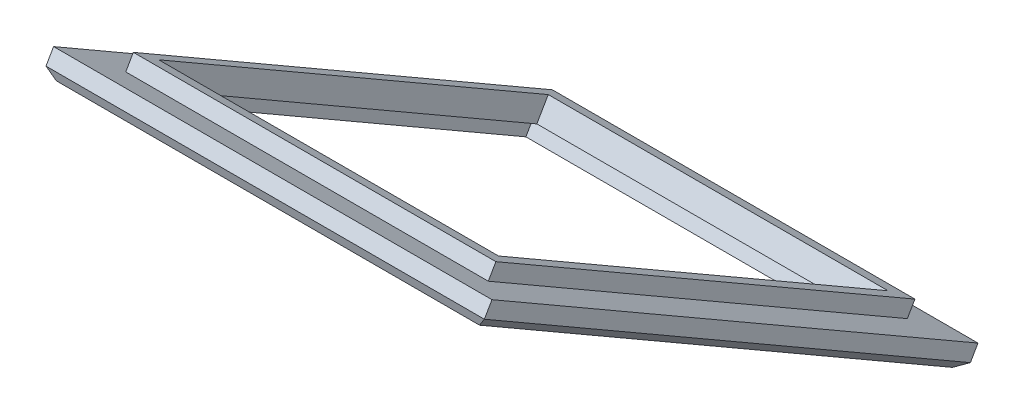
ISO-10303-21;
HEADER;
FILE_DESCRIPTION(('STEP AP214'),'2;1');
FILE_NAME('part.step','',(''),(''),'','','');
FILE_SCHEMA(('AUTOMOTIVE_DESIGN { 1 0 10303 214 1 1 1 1 }'));
ENDSEC;
DATA;
#1=APPLICATION_CONTEXT('core data for automotive mechanical design processes');
#2=APPLICATION_PROTOCOL_DEFINITION('international standard','automotive_design',2000,#1);
#3=PRODUCT_CONTEXT('',#1,'mechanical');
#4=PRODUCT('Part','Part','',(#3));
#5=PRODUCT_RELATED_PRODUCT_CATEGORY('part','',(#4));
#6=PRODUCT_DEFINITION_FORMATION('','',#4);
#7=PRODUCT_DEFINITION_CONTEXT('part definition',#1,'design');
#8=PRODUCT_DEFINITION('design','',#6,#7);
#9=PRODUCT_DEFINITION_SHAPE('','',#8);
#10=(LENGTH_UNIT() NAMED_UNIT(*) SI_UNIT(.MILLI.,.METRE.));
#11=(NAMED_UNIT(*) PLANE_ANGLE_UNIT() SI_UNIT($,.RADIAN.));
#12=(NAMED_UNIT(*) SI_UNIT($,.STERADIAN.) SOLID_ANGLE_UNIT());
#13=UNCERTAINTY_MEASURE_WITH_UNIT(LENGTH_MEASURE(1.E-05),#10,'distance_accuracy_value','');
#14=(GEOMETRIC_REPRESENTATION_CONTEXT(3) GLOBAL_UNCERTAINTY_ASSIGNED_CONTEXT((#13)) GLOBAL_UNIT_ASSIGNED_CONTEXT((#10,
#11,#12)) REPRESENTATION_CONTEXT('',''));
#15=CARTESIAN_POINT('',(0.,0.,0.));
#16=DIRECTION('',(0.,0.,1.));
#17=DIRECTION('',(1.,0.,0.));
#18=AXIS2_PLACEMENT_3D('',#15,#16,#17);
#19=CARTESIAN_POINT('',(-20.3754297395793,-24.2225456393446,122.650648453835));
#20=DIRECTION('',(-1.,0.,0.));
#21=DIRECTION('',(0.,0.,1.));
#22=AXIS2_PLACEMENT_3D('',#19,#20,#21);
#23=PLANE('',#22);
#24=DIRECTION('',(0.,0.500000000000004,0.866025403784437));
#25=VECTOR('',#24,1.);
#26=CARTESIAN_POINT('',(-20.3754297395793,-25.0885710431292,123.150648453835));
#27=LINE('',#26,#25);
#28=CARTESIAN_POINT('',(-20.3754297395793,-54.7385710431249,71.7953420094262));
#29=VERTEX_POINT('',#28);
#30=CARTESIAN_POINT('',(-20.3754297395793,-25.0885710431292,123.150648453835));
#31=VERTEX_POINT('',#30);
#32=EDGE_CURVE('E210',#29,#31,#27,.T.);
#33=ORIENTED_EDGE('',*,*,#32,.F.);
#34=DIRECTION('',(0.,-0.866025403784436,0.500000000000004));
#35=VECTOR('',#34,1.);
#36=CARTESIAN_POINT('',(-20.3754297395793,-53.8725456393404,71.2953420094261));
#37=LINE('',#36,#35);
#38=CARTESIAN_POINT('',(-20.3754297395793,-52.1404948317715,70.2953420094261));
#39=VERTEX_POINT('',#38);
#40=EDGE_CURVE('E268',#39,#29,#37,.T.);
#41=ORIENTED_EDGE('',*,*,#40,.F.);
#42=DIRECTION('',(0.,-0.500000000000004,-0.866025403784436));
#43=VECTOR('',#42,1.);
#44=CARTESIAN_POINT('',(-20.3754297395793,-22.4904948317758,121.650648453835));
#45=LINE('',#44,#43);
#46=CARTESIAN_POINT('',(-20.3754297395793,-22.4904948317758,121.650648453835));
#47=VERTEX_POINT('',#46);
#48=EDGE_CURVE('E229',#47,#39,#45,.T.);
#49=ORIENTED_EDGE('',*,*,#48,.F.);
#50=DIRECTION('',(0.,-0.866025403784436,0.500000000000004));
#51=VECTOR('',#50,1.);
#52=CARTESIAN_POINT('',(-20.3754297395793,-24.2225456393446,122.650648453835));
#53=LINE('',#52,#51);
#54=EDGE_CURVE('E256',#47,#31,#53,.T.);
#55=ORIENTED_EDGE('',*,*,#54,.T.);
#56=EDGE_LOOP('',(#33,#41,#49,#55));
#57=FACE_BOUND('',#56,.T.);
#58=ADVANCED_FACE('F41',(#57),#23,.F.);
#59=CARTESIAN_POINT('',(24.4245702604207,-24.2225456393447,122.650648453835));
#60=DIRECTION('',(0.,0.500000000000004,0.866025403784436));
#61=DIRECTION('',(0.,-0.866025403784436,0.500000000000004));
#62=AXIS2_PLACEMENT_3D('',#59,#60,#61);
#63=PLANE('',#62);
#64=DIRECTION('',(1.,0.,0.));
#65=VECTOR('',#64,1.);
#66=CARTESIAN_POINT('',(24.4245702604207,-25.0885710431292,123.150648453835));
#67=LINE('',#66,#65);
#68=CARTESIAN_POINT('',(24.4245702604207,-25.0885710431292,123.150648453835));
#69=VERTEX_POINT('',#68);
#70=EDGE_CURVE('E201',#31,#69,#67,.T.);
#71=ORIENTED_EDGE('',*,*,#70,.F.);
#72=ORIENTED_EDGE('',*,*,#54,.F.);
#73=DIRECTION('',(-1.,0.,0.));
#74=VECTOR('',#73,1.);
#75=CARTESIAN_POINT('',(24.4245702604207,-22.4904948317758,121.650648453835));
#76=LINE('',#75,#74);
#77=CARTESIAN_POINT('',(24.4245702604207,-22.4904948317758,121.650648453835));
#78=VERTEX_POINT('',#77);
#79=EDGE_CURVE('E211',#78,#47,#76,.T.);
#80=ORIENTED_EDGE('',*,*,#79,.F.);
#81=DIRECTION('',(0.,-0.866025403784436,0.500000000000004));
#82=VECTOR('',#81,1.);
#83=CARTESIAN_POINT('',(24.4245702604207,-24.2225456393447,122.650648453835));
#84=LINE('',#83,#82);
#85=EDGE_CURVE('E265',#78,#69,#84,.T.);
#86=ORIENTED_EDGE('',*,*,#85,.T.);
#87=EDGE_LOOP('',(#71,#72,#80,#86));
#88=FACE_BOUND('',#87,.T.);
#89=ADVANCED_FACE('F370',(#88),#63,.F.);
#90=CARTESIAN_POINT('',(24.4245702604207,-53.8725456393404,71.2953420094261));
#91=DIRECTION('',(1.,0.,0.));
#92=DIRECTION('',(0.,0.,-1.));
#93=AXIS2_PLACEMENT_3D('',#90,#91,#92);
#94=PLANE('',#93);
#95=DIRECTION('',(0.,-0.500000000000004,-0.866025403784437));
#96=VECTOR('',#95,1.);
#97=CARTESIAN_POINT('',(24.4245702604207,-54.7385710431249,71.7953420094261));
#98=LINE('',#97,#96);
#99=CARTESIAN_POINT('',(24.4245702604207,-54.7385710431249,71.7953420094261));
#100=VERTEX_POINT('',#99);
#101=EDGE_CURVE('E62',#69,#100,#98,.T.);
#102=ORIENTED_EDGE('',*,*,#101,.F.);
#103=ORIENTED_EDGE('',*,*,#85,.F.);
#104=DIRECTION('',(0.,0.500000000000004,0.866025403784436));
#105=VECTOR('',#104,1.);
#106=CARTESIAN_POINT('',(24.4245702604207,-52.1404948317715,70.2953420094261));
#107=LINE('',#106,#105);
#108=CARTESIAN_POINT('',(24.4245702604207,-52.1404948317715,70.2953420094261));
#109=VERTEX_POINT('',#108);
#110=EDGE_CURVE('E255',#109,#78,#107,.T.);
#111=ORIENTED_EDGE('',*,*,#110,.F.);
#112=DIRECTION('',(0.,-0.866025403784436,0.500000000000004));
#113=VECTOR('',#112,1.);
#114=CARTESIAN_POINT('',(24.4245702604207,-53.8725456393404,71.2953420094261));
#115=LINE('',#114,#113);
#116=EDGE_CURVE('E264',#109,#100,#115,.T.);
#117=ORIENTED_EDGE('',*,*,#116,.T.);
#118=EDGE_LOOP('',(#102,#103,#111,#117));
#119=FACE_BOUND('',#118,.T.);
#120=ADVANCED_FACE('F372',(#119),#94,.F.);
#121=CARTESIAN_POINT('',(-20.3754297395793,-53.8725456393404,71.2953420094261));
#122=DIRECTION('',(0.,-0.500000000000004,-0.866025403784436));
#123=DIRECTION('',(0.,0.866025403784436,-0.500000000000004));
#124=AXIS2_PLACEMENT_3D('',#121,#122,#123);
#125=PLANE('',#124);
#126=DIRECTION('',(-1.,0.,0.));
#127=VECTOR('',#126,1.);
#128=CARTESIAN_POINT('',(-20.3754297395793,-54.7385710431249,71.7953420094262));
#129=LINE('',#128,#127);
#130=EDGE_CURVE('E11',#100,#29,#129,.T.);
#131=ORIENTED_EDGE('',*,*,#130,.F.);
#132=ORIENTED_EDGE('',*,*,#116,.F.);
#133=DIRECTION('',(1.,0.,0.));
#134=VECTOR('',#133,1.);
#135=CARTESIAN_POINT('',(-20.3754297395793,-52.1404948317715,70.2953420094261));
#136=LINE('',#135,#134);
#137=EDGE_CURVE('E231',#39,#109,#136,.T.);
#138=ORIENTED_EDGE('',*,*,#137,.F.);
#139=ORIENTED_EDGE('',*,*,#40,.T.);
#140=EDGE_LOOP('',(#131,#132,#138,#139));
#141=FACE_BOUND('',#140,.T.);
#142=ADVANCED_FACE('F378',(#141),#125,.F.);
#143=CARTESIAN_POINT('',(0.,-71.2761979053367,41.1513320474596));
#144=DIRECTION('',(0.,-0.866025403784436,0.500000000000004));
#145=DIRECTION('',(0.,-0.500000000000004,-0.866025403784436));
#146=AXIS2_PLACEMENT_3D('',#143,#144,#145);
#147=PLANE('',#146);
#148=DIRECTION('',(0.,-0.500000000000004,-0.866025403784436));
#149=VECTOR('',#148,1.);
#150=CARTESIAN_POINT('',(-26.8754297395794,-20.5475456393428,129.015935171654));
#151=LINE('',#150,#149);
#152=CARTESIAN_POINT('',(-26.8754297395794,-20.5475456393428,129.015935171654));
#153=VERTEX_POINT('',#152);
#154=CARTESIAN_POINT('',(-26.8754297395794,-57.5475456393431,64.9300552916059));
#155=VERTEX_POINT('',#154);
#156=EDGE_CURVE('E261',#153,#155,#151,.T.);
#157=ORIENTED_EDGE('',*,*,#156,.F.);
#158=DIRECTION('',(-1.,0.,0.));
#159=VECTOR('',#158,1.);
#160=CARTESIAN_POINT('',(30.9245702604208,-20.5475456393428,129.015935171654));
#161=LINE('',#160,#159);
#162=CARTESIAN_POINT('',(30.9245702604208,-20.5475456393428,129.015935171654));
#163=VERTEX_POINT('',#162);
#164=EDGE_CURVE('E279',#163,#153,#161,.T.);
#165=ORIENTED_EDGE('',*,*,#164,.F.);
#166=DIRECTION('',(0.,0.500000000000004,0.866025403784436));
#167=VECTOR('',#166,1.);
#168=CARTESIAN_POINT('',(30.9245702604208,-57.5475456393431,64.9300552916059));
#169=LINE('',#168,#167);
#170=CARTESIAN_POINT('',(30.9245702604208,-57.5475456393431,64.9300552916059));
#171=VERTEX_POINT('',#170);
#172=EDGE_CURVE('E280',#171,#163,#169,.T.);
#173=ORIENTED_EDGE('',*,*,#172,.F.);
#174=DIRECTION('',(1.,0.,0.));
#175=VECTOR('',#174,1.);
#176=CARTESIAN_POINT('',(-26.8754297395794,-57.5475456393431,64.9300552916059));
#177=LINE('',#176,#175);
#178=EDGE_CURVE('E274',#155,#171,#177,.T.);
#179=ORIENTED_EDGE('',*,*,#178,.F.);
#180=EDGE_LOOP('',(#157,#165,#173,#179));
#181=FACE_BOUND('',#180,.T.);
#182=DIRECTION('',(0.,-0.500000000000004,-0.866025403784436));
#183=VECTOR('',#182,1.);
#184=CARTESIAN_POINT('',(26.0245702604206,-23.0975456393428,124.599205612354));
#185=LINE('',#184,#183);
#186=CARTESIAN_POINT('',(26.0245702604206,-23.0975456393428,124.599205612354));
#187=VERTEX_POINT('',#186);
#188=CARTESIAN_POINT('',(26.0245702604206,-54.9975456393431,69.3467848509065));
#189=VERTEX_POINT('',#188);
#190=EDGE_CURVE('E221',#187,#189,#185,.T.);
#191=ORIENTED_EDGE('',*,*,#190,.F.);
#192=DIRECTION('',(1.,0.,0.));
#193=VECTOR('',#192,1.);
#194=CARTESIAN_POINT('',(26.0245702604206,-23.0975456393428,124.599205612354));
#195=LINE('',#194,#193);
#196=CARTESIAN_POINT('',(-21.7754297395794,-23.0975456393428,124.599205612354));
#197=VERTEX_POINT('',#196);
#198=EDGE_CURVE('E208',#197,#187,#195,.T.);
#199=ORIENTED_EDGE('',*,*,#198,.F.);
#200=DIRECTION('',(0.,0.500000000000004,0.866025403784436));
#201=VECTOR('',#200,1.);
#202=CARTESIAN_POINT('',(-21.7754297395794,-23.0975456393428,124.599205612354));
#203=LINE('',#202,#201);
#204=CARTESIAN_POINT('',(-21.7754297395794,-54.9975456393431,69.3467848509064));
#205=VERTEX_POINT('',#204);
#206=EDGE_CURVE('E214',#205,#197,#203,.T.);
#207=ORIENTED_EDGE('',*,*,#206,.F.);
#208=DIRECTION('',(-1.,0.,0.));
#209=VECTOR('',#208,1.);
#210=CARTESIAN_POINT('',(26.0245702604206,-54.9975456393431,69.3467848509066));
#211=LINE('',#210,#209);
#212=EDGE_CURVE('E219',#189,#205,#211,.T.);
#213=ORIENTED_EDGE('',*,*,#212,.F.);
#214=EDGE_LOOP('',(#191,#199,#207,#213));
#215=FACE_BOUND('',#214,.T.);
#216=ADVANCED_FACE('F336',(#181,#215),#147,.F.);
#217=CARTESIAN_POINT('',(-26.8754297395794,-20.5475456393428,129.015935171654));
#218=DIRECTION('',(-1.,0.,0.));
#219=DIRECTION('',(0.,0.,1.));
#220=AXIS2_PLACEMENT_3D('',#217,#218,#219);
#221=PLANE('',#220);
#222=DIRECTION('',(0.,-0.866025403784436,0.500000000000004));
#223=VECTOR('',#222,1.);
#224=CARTESIAN_POINT('',(-26.8754297395794,-57.5475456393431,64.9300552916059));
#225=LINE('',#224,#223);
#226=CARTESIAN_POINT('',(-26.8754297395794,-59.279596446912,65.9300552916059));
#227=VERTEX_POINT('',#226);
#228=EDGE_CURVE('E283',#155,#227,#225,.T.);
#229=ORIENTED_EDGE('',*,*,#228,.T.);
#230=DIRECTION('',(0.,0.500000000000004,0.866025403784436));
#231=VECTOR('',#230,1.);
#232=CARTESIAN_POINT('',(-26.8754297395794,-22.2795964469117,130.015935171654));
#233=LINE('',#232,#231);
#234=CARTESIAN_POINT('',(-26.8754297395794,-22.2795964469116,130.015935171654));
#235=VERTEX_POINT('',#234);
#236=EDGE_CURVE('E307',#227,#235,#233,.T.);
#237=ORIENTED_EDGE('',*,*,#236,.T.);
#238=DIRECTION('',(0.,-0.866025403784436,0.500000000000004));
#239=VECTOR('',#238,1.);
#240=CARTESIAN_POINT('',(-26.8754297395794,-20.5475456393428,129.015935171654));
#241=LINE('',#240,#239);
#242=EDGE_CURVE('E282',#153,#235,#241,.T.);
#243=ORIENTED_EDGE('',*,*,#242,.F.);
#244=ORIENTED_EDGE('',*,*,#156,.T.);
#245=EDGE_LOOP('',(#229,#237,#243,#244));
#246=FACE_BOUND('',#245,.T.);
#247=ADVANCED_FACE('F343',(#246),#221,.T.);
#248=CARTESIAN_POINT('',(30.9245702604208,-20.5475456393428,129.015935171654));
#249=DIRECTION('',(0.,0.500000000000004,0.866025403784436));
#250=DIRECTION('',(0.,-0.866025403784436,0.500000000000004));
#251=AXIS2_PLACEMENT_3D('',#248,#249,#250);
#252=PLANE('',#251);
#253=ORIENTED_EDGE('',*,*,#242,.T.);
#254=DIRECTION('',(1.,0.,0.));
#255=VECTOR('',#254,1.);
#256=CARTESIAN_POINT('',(30.9245702604208,-22.2795964469117,130.015935171654));
#257=LINE('',#256,#255);
#258=CARTESIAN_POINT('',(30.9245702604208,-22.2795964469117,130.015935171654));
#259=VERTEX_POINT('',#258);
#260=EDGE_CURVE('E49',#235,#259,#257,.T.);
#261=ORIENTED_EDGE('',*,*,#260,.T.);
#262=DIRECTION('',(0.,-0.866025403784436,0.500000000000004));
#263=VECTOR('',#262,1.);
#264=CARTESIAN_POINT('',(30.9245702604208,-20.5475456393428,129.015935171654));
#265=LINE('',#264,#263);
#266=EDGE_CURVE('E288',#163,#259,#265,.T.);
#267=ORIENTED_EDGE('',*,*,#266,.F.);
#268=ORIENTED_EDGE('',*,*,#164,.T.);
#269=EDGE_LOOP('',(#253,#261,#267,#268));
#270=FACE_BOUND('',#269,.T.);
#271=ADVANCED_FACE('F329',(#270),#252,.T.);
#272=CARTESIAN_POINT('',(30.9245702604208,-57.5475456393431,64.9300552916059));
#273=DIRECTION('',(1.,0.,0.));
#274=DIRECTION('',(0.,0.,-1.));
#275=AXIS2_PLACEMENT_3D('',#272,#273,#274);
#276=PLANE('',#275);
#277=ORIENTED_EDGE('',*,*,#266,.T.);
#278=DIRECTION('',(0.,-0.500000000000004,-0.866025403784436));
#279=VECTOR('',#278,1.);
#280=CARTESIAN_POINT('',(30.9245702604208,-59.279596446912,65.9300552916059));
#281=LINE('',#280,#279);
#282=CARTESIAN_POINT('',(30.9245702604208,-59.279596446912,65.9300552916059));
#283=VERTEX_POINT('',#282);
#284=EDGE_CURVE('E310',#259,#283,#281,.T.);
#285=ORIENTED_EDGE('',*,*,#284,.T.);
#286=DIRECTION('',(0.,-0.866025403784436,0.500000000000004));
#287=VECTOR('',#286,1.);
#288=CARTESIAN_POINT('',(30.9245702604208,-57.5475456393431,64.9300552916059));
#289=LINE('',#288,#287);
#290=EDGE_CURVE('E293',#171,#283,#289,.T.);
#291=ORIENTED_EDGE('',*,*,#290,.F.);
#292=ORIENTED_EDGE('',*,*,#172,.T.);
#293=EDGE_LOOP('',(#277,#285,#291,#292));
#294=FACE_BOUND('',#293,.T.);
#295=ADVANCED_FACE('F335',(#294),#276,.T.);
#296=CARTESIAN_POINT('',(-26.8754297395794,-57.5475456393431,64.9300552916059));
#297=DIRECTION('',(0.,-0.500000000000004,-0.866025403784436));
#298=DIRECTION('',(0.,0.866025403784436,-0.500000000000004));
#299=AXIS2_PLACEMENT_3D('',#296,#297,#298);
#300=PLANE('',#299);
#301=ORIENTED_EDGE('',*,*,#290,.T.);
#302=DIRECTION('',(-1.,0.,0.));
#303=VECTOR('',#302,1.);
#304=CARTESIAN_POINT('',(-26.8754297395794,-59.279596446912,65.9300552916059));
#305=LINE('',#304,#303);
#306=EDGE_CURVE('E302',#283,#227,#305,.T.);
#307=ORIENTED_EDGE('',*,*,#306,.T.);
#308=ORIENTED_EDGE('',*,*,#228,.F.);
#309=ORIENTED_EDGE('',*,*,#178,.T.);
#310=EDGE_LOOP('',(#301,#307,#308,#309));
#311=FACE_BOUND('',#310,.T.);
#312=ADVANCED_FACE('F341',(#311),#300,.T.);
#313=CARTESIAN_POINT('',(0.,-73.87427411669,42.6513320474596));
#314=DIRECTION('',(0.,-0.866025403784436,0.500000000000004));
#315=DIRECTION('',(0.,-0.500000000000004,-0.866025403784436));
#316=AXIS2_PLACEMENT_3D('',#313,#314,#315);
#317=PLANE('',#316);
#318=DIRECTION('',(0.,-0.500000000000004,-0.866025403784437));
#319=VECTOR('',#318,1.);
#320=CARTESIAN_POINT('',(-22.0754297395793,-26.0956218506958,125.406385289327));
#321=LINE('',#320,#319);
#322=CARTESIAN_POINT('',(-22.0754297395793,-26.0956218506958,125.406385289327));
#323=VERTEX_POINT('',#322);
#324=CARTESIAN_POINT('',(-22.0754297395793,-57.195621850696,71.5396051739348));
#325=VERTEX_POINT('',#324);
#326=EDGE_CURVE('E60',#323,#325,#321,.T.);
#327=ORIENTED_EDGE('',*,*,#326,.F.);
#328=DIRECTION('',(-1.,0.,0.));
#329=VECTOR('',#328,1.);
#330=CARTESIAN_POINT('',(-22.0754297395793,-26.0956218506958,125.406385289327));
#331=LINE('',#330,#329);
#332=CARTESIAN_POINT('',(26.1245702604207,-26.0956218506958,125.406385289327));
#333=VERTEX_POINT('',#332);
#334=EDGE_CURVE('E187',#333,#323,#331,.T.);
#335=ORIENTED_EDGE('',*,*,#334,.F.);
#336=DIRECTION('',(0.,0.500000000000004,0.866025403784436));
#337=VECTOR('',#336,1.);
#338=CARTESIAN_POINT('',(26.1245702604207,-26.0956218506958,125.406385289327));
#339=LINE('',#338,#337);
#340=CARTESIAN_POINT('',(26.1245702604207,-57.195621850696,71.5396051739348));
#341=VERTEX_POINT('',#340);
#342=EDGE_CURVE('E186',#341,#333,#339,.T.);
#343=ORIENTED_EDGE('',*,*,#342,.F.);
#344=DIRECTION('',(1.,0.,0.));
#345=VECTOR('',#344,1.);
#346=CARTESIAN_POINT('',(-22.0754297395793,-57.195621850696,71.5396051739348));
#347=LINE('',#346,#345);
#348=EDGE_CURVE('E194',#325,#341,#347,.T.);
#349=ORIENTED_EDGE('',*,*,#348,.F.);
#350=EDGE_LOOP('',(#327,#335,#343,#349));
#351=FACE_BOUND('',#350,.T.);
#352=DIRECTION('',(0.,-0.500000000000004,-0.866025403784436));
#353=VECTOR('',#352,1.);
#354=CARTESIAN_POINT('',(-25.8754297395794,-73.87427411669,42.6513320474596));
#355=LINE('',#354,#353);
#356=CARTESIAN_POINT('',(-25.8754297395794,-23.6456218506961,129.64990976787));
#357=VERTEX_POINT('',#356);
#358=CARTESIAN_POINT('',(-25.8754297395794,-59.6456218506964,67.2960806953904));
#359=VERTEX_POINT('',#358);
#360=EDGE_CURVE('E300',#357,#359,#355,.T.);
#361=ORIENTED_EDGE('',*,*,#360,.T.);
#362=DIRECTION('',(1.,0.,0.));
#363=VECTOR('',#362,1.);
#364=CARTESIAN_POINT('',(0.,-59.6456218506964,67.2960806953904));
#365=LINE('',#364,#363);
#366=CARTESIAN_POINT('',(29.9245702604208,-59.6456218506964,67.2960806953904));
#367=VERTEX_POINT('',#366);
#368=EDGE_CURVE('E301',#359,#367,#365,.T.);
#369=ORIENTED_EDGE('',*,*,#368,.T.);
#370=DIRECTION('',(0.,0.500000000000004,0.866025403784436));
#371=VECTOR('',#370,1.);
#372=CARTESIAN_POINT('',(29.9245702604208,-73.87427411669,42.6513320474596));
#373=LINE('',#372,#371);
#374=CARTESIAN_POINT('',(29.9245702604208,-23.6456218506961,129.64990976787));
#375=VERTEX_POINT('',#374);
#376=EDGE_CURVE('E299',#367,#375,#373,.T.);
#377=ORIENTED_EDGE('',*,*,#376,.T.);
#378=DIRECTION('',(-1.,0.,0.));
#379=VECTOR('',#378,1.);
#380=CARTESIAN_POINT('',(0.,-23.6456218506961,129.64990976787));
#381=LINE('',#380,#379);
#382=EDGE_CURVE('E290',#375,#357,#381,.T.);
#383=ORIENTED_EDGE('',*,*,#382,.T.);
#384=EDGE_LOOP('',(#361,#369,#377,#383));
#385=FACE_BOUND('',#384,.T.);
#386=ADVANCED_FACE('F353',(#351,#385),#317,.T.);
#387=CARTESIAN_POINT('',(0.,-23.6456218506961,129.64990976787));
#388=DIRECTION('',(0.,0.258819045102513,-0.965925826289071));
#389=DIRECTION('',(-1.,0.,0.));
#390=AXIS2_PLACEMENT_3D('',#387,#388,#389);
#391=PLANE('',#390);
#392=DIRECTION('',(0.577350269189632,0.78867513459481,0.211324865405179));
#393=VECTOR('',#392,1.);
#394=CARTESIAN_POINT('',(19.949713506947,-37.2715295750519,125.998858796988));
#395=LINE('',#394,#393);
#396=EDGE_CURVE('E314',#259,#375,#395,.F.);
#397=ORIENTED_EDGE('',*,*,#396,.F.);
#398=ORIENTED_EDGE('',*,*,#260,.F.);
#399=DIRECTION('',(0.577350269189631,-0.788675134594811,-0.21132486540518));
#400=VECTOR('',#399,1.);
#401=CARTESIAN_POINT('',(-17.2502864930528,-35.4277866367311,126.492888228361));
#402=LINE('',#401,#400);
#403=EDGE_CURVE('E272',#357,#235,#402,.F.);
#404=ORIENTED_EDGE('',*,*,#403,.F.);
#405=ORIENTED_EDGE('',*,*,#382,.F.);
#406=EDGE_LOOP('',(#397,#398,#404,#405));
#407=FACE_BOUND('',#406,.T.);
#408=ADVANCED_FACE('F42',(#407),#391,.F.);
#409=CARTESIAN_POINT('',(-25.8754297395794,-73.87427411669,42.6513320474596));
#410=DIRECTION('',(0.707106781186544,0.612372435695796,-0.353553390593279));
#411=DIRECTION('',(0.,-0.500000000000004,-0.866025403784436));
#412=AXIS2_PLACEMENT_3D('',#409,#410,#411);
#413=PLANE('',#412);
#414=ORIENTED_EDGE('',*,*,#403,.T.);
#415=ORIENTED_EDGE('',*,*,#236,.F.);
#416=DIRECTION('',(0.577350269189626,-0.211324865405176,0.788675134594816));
#417=VECTOR('',#416,1.);
#418=CARTESIAN_POINT('',(-35.3611979169085,-56.1735897233841,54.3382803907488));
#419=LINE('',#418,#417);
#420=EDGE_CURVE('E312',#359,#227,#419,.F.);
#421=ORIENTED_EDGE('',*,*,#420,.F.);
#422=ORIENTED_EDGE('',*,*,#360,.F.);
#423=EDGE_LOOP('',(#414,#415,#421,#422));
#424=FACE_BOUND('',#423,.T.);
#425=ADVANCED_FACE('F325',(#424),#413,.F.);
#426=CARTESIAN_POINT('',(29.9245702604208,-73.87427411669,42.6513320474596));
#427=DIRECTION('',(-0.707106781186543,0.612372435695797,-0.353553390593279));
#428=DIRECTION('',(0.,0.500000000000004,0.866025403784436));
#429=AXIS2_PLACEMENT_3D('',#426,#427,#428);
#430=PLANE('',#429);
#431=ORIENTED_EDGE('',*,*,#396,.T.);
#432=ORIENTED_EDGE('',*,*,#376,.F.);
#433=DIRECTION('',(0.577350269189627,0.211324865405175,-0.788675134594815));
#434=VECTOR('',#433,1.);
#435=CARTESIAN_POINT('',(39.4103384377499,-56.1735897233841,54.3382803907488));
#436=LINE('',#435,#434);
#437=EDGE_CURVE('E253',#283,#367,#436,.F.);
#438=ORIENTED_EDGE('',*,*,#437,.F.);
#439=ORIENTED_EDGE('',*,*,#284,.F.);
#440=EDGE_LOOP('',(#431,#432,#438,#439));
#441=FACE_BOUND('',#440,.T.);
#442=ADVANCED_FACE('F352',(#441),#430,.F.);
#443=CARTESIAN_POINT('',(0.,-59.6456218506964,67.2960806953904));
#444=DIRECTION('',(0.,0.965925826289072,0.258819045102507));
#445=DIRECTION('',(1.,0.,0.));
#446=AXIS2_PLACEMENT_3D('',#443,#444,#445);
#447=PLANE('',#446);
#448=ORIENTED_EDGE('',*,*,#420,.T.);
#449=ORIENTED_EDGE('',*,*,#306,.F.);
#450=ORIENTED_EDGE('',*,*,#437,.T.);
#451=ORIENTED_EDGE('',*,*,#368,.F.);
#452=EDGE_LOOP('',(#448,#449,#450,#451));
#453=FACE_BOUND('',#452,.T.);
#454=ADVANCED_FACE('F350',(#453),#447,.F.);
#455=CARTESIAN_POINT('',(26.0245702604206,47.6740590485923,83.7392005947922));
#456=DIRECTION('',(-1.,0.,0.));
#457=DIRECTION('',(0.,0.,1.));
#458=AXIS2_PLACEMENT_3D('',#455,#456,#457);
#459=PLANE('',#458);
#460=DIRECTION('',(0.,-0.866025403784436,0.500000000000004));
#461=VECTOR('',#460,1.);
#462=CARTESIAN_POINT('',(26.0245702604206,15.774059048592,28.4867798333451));
#463=LINE('',#462,#461);
#464=CARTESIAN_POINT('',(26.0245702604206,-53.2654948317742,68.3467848509065));
#465=VERTEX_POINT('',#464);
#466=EDGE_CURVE('E224',#465,#189,#463,.T.);
#467=ORIENTED_EDGE('',*,*,#466,.F.);
#468=DIRECTION('',(0.,0.500000000000004,0.866025403784436));
#469=VECTOR('',#468,1.);
#470=CARTESIAN_POINT('',(26.0245702604206,-21.3654948317739,123.599205612354));
#471=LINE('',#470,#469);
#472=CARTESIAN_POINT('',(26.0245702604206,-21.3654948317739,123.599205612354));
#473=VERTEX_POINT('',#472);
#474=EDGE_CURVE('E209',#465,#473,#471,.T.);
#475=ORIENTED_EDGE('',*,*,#474,.T.);
#476=DIRECTION('',(0.,-0.866025403784436,0.500000000000004));
#477=VECTOR('',#476,1.);
#478=CARTESIAN_POINT('',(26.0245702604206,47.6740590485923,83.7392005947922));
#479=LINE('',#478,#477);
#480=EDGE_CURVE('E230',#473,#187,#479,.T.);
#481=ORIENTED_EDGE('',*,*,#480,.T.);
#482=ORIENTED_EDGE('',*,*,#190,.T.);
#483=EDGE_LOOP('',(#467,#475,#481,#482));
#484=FACE_BOUND('',#483,.T.);
#485=ADVANCED_FACE('F429',(#484),#459,.F.);
#486=CARTESIAN_POINT('',(26.0245702604206,15.774059048592,28.4867798333451));
#487=DIRECTION('',(0.,0.500000000000004,0.866025403784436));
#488=DIRECTION('',(0.,-0.866025403784437,0.500000000000004));
#489=AXIS2_PLACEMENT_3D('',#486,#487,#488);
#490=PLANE('',#489);
#491=DIRECTION('',(0.,-0.866025403784436,0.500000000000004));
#492=VECTOR('',#491,1.);
#493=CARTESIAN_POINT('',(-21.7754297395794,15.774059048592,28.4867798333451));
#494=LINE('',#493,#492);
#495=CARTESIAN_POINT('',(-21.7754297395794,-53.2654948317742,68.3467848509065));
#496=VERTEX_POINT('',#495);
#497=EDGE_CURVE('E217',#496,#205,#494,.T.);
#498=ORIENTED_EDGE('',*,*,#497,.F.);
#499=DIRECTION('',(1.,0.,0.));
#500=VECTOR('',#499,1.);
#501=CARTESIAN_POINT('',(26.0245702604206,-53.2654948317742,68.3467848509065));
#502=LINE('',#501,#500);
#503=EDGE_CURVE('E226',#496,#465,#502,.T.);
#504=ORIENTED_EDGE('',*,*,#503,.T.);
#505=ORIENTED_EDGE('',*,*,#466,.T.);
#506=ORIENTED_EDGE('',*,*,#212,.T.);
#507=EDGE_LOOP('',(#498,#504,#505,#506));
#508=FACE_BOUND('',#507,.T.);
#509=ADVANCED_FACE('F424',(#508),#490,.F.);
#510=CARTESIAN_POINT('',(-21.7754297395794,47.6740590485923,83.7392005947922));
#511=DIRECTION('',(1.,0.,0.));
#512=DIRECTION('',(0.,1.,0.));
#513=AXIS2_PLACEMENT_3D('',#510,#511,#512);
#514=PLANE('',#513);
#515=DIRECTION('',(0.,-0.866025403784436,0.500000000000004));
#516=VECTOR('',#515,1.);
#517=CARTESIAN_POINT('',(-21.7754297395794,47.6740590485923,83.7392005947922));
#518=LINE('',#517,#516);
#519=CARTESIAN_POINT('',(-21.7754297395794,-21.3654948317739,123.599205612354));
#520=VERTEX_POINT('',#519);
#521=EDGE_CURVE('E212',#520,#197,#518,.T.);
#522=ORIENTED_EDGE('',*,*,#521,.F.);
#523=DIRECTION('',(0.,-0.500000000000004,-0.866025403784436));
#524=VECTOR('',#523,1.);
#525=CARTESIAN_POINT('',(-21.7754297395794,-21.3654948317739,123.599205612354));
#526=LINE('',#525,#524);
#527=EDGE_CURVE('E223',#520,#496,#526,.T.);
#528=ORIENTED_EDGE('',*,*,#527,.T.);
#529=ORIENTED_EDGE('',*,*,#497,.T.);
#530=ORIENTED_EDGE('',*,*,#206,.T.);
#531=EDGE_LOOP('',(#522,#528,#529,#530));
#532=FACE_BOUND('',#531,.T.);
#533=ADVANCED_FACE('F423',(#532),#514,.F.);
#534=CARTESIAN_POINT('',(26.0245702604206,47.6740590485923,83.7392005947922));
#535=DIRECTION('',(0.,-0.500000000000004,-0.866025403784436));
#536=DIRECTION('',(0.,0.866025403784437,-0.500000000000004));
#537=AXIS2_PLACEMENT_3D('',#534,#535,#536);
#538=PLANE('',#537);
#539=ORIENTED_EDGE('',*,*,#480,.F.);
#540=DIRECTION('',(-1.,0.,0.));
#541=VECTOR('',#540,1.);
#542=CARTESIAN_POINT('',(26.0245702604206,-21.3654948317739,123.599205612354));
#543=LINE('',#542,#541);
#544=EDGE_CURVE('E218',#473,#520,#543,.T.);
#545=ORIENTED_EDGE('',*,*,#544,.T.);
#546=ORIENTED_EDGE('',*,*,#521,.T.);
#547=ORIENTED_EDGE('',*,*,#198,.T.);
#548=EDGE_LOOP('',(#539,#545,#546,#547));
#549=FACE_BOUND('',#548,.T.);
#550=ADVANCED_FACE('F410',(#549),#538,.F.);
#551=CARTESIAN_POINT('',(75.4751647251253,-15.3438069952868,134.029074892469));
#552=DIRECTION('',(0.,-0.866025403784436,0.500000000000004));
#553=DIRECTION('',(0.,-0.500000000000004,-0.866025403784436));
#554=AXIS2_PLACEMENT_3D('',#551,#552,#553);
#555=PLANE('',#554);
#556=ORIENTED_EDGE('',*,*,#79,.T.);
#557=ORIENTED_EDGE('',*,*,#48,.T.);
#558=ORIENTED_EDGE('',*,*,#137,.T.);
#559=ORIENTED_EDGE('',*,*,#110,.T.);
#560=EDGE_LOOP('',(#556,#557,#558,#559));
#561=FACE_BOUND('',#560,.T.);
#562=ORIENTED_EDGE('',*,*,#503,.F.);
#563=ORIENTED_EDGE('',*,*,#527,.F.);
#564=ORIENTED_EDGE('',*,*,#544,.F.);
#565=ORIENTED_EDGE('',*,*,#474,.F.);
#566=EDGE_LOOP('',(#562,#563,#564,#565));
#567=FACE_BOUND('',#566,.T.);
#568=ADVANCED_FACE('F400',(#561,#567),#555,.F.);
#569=CARTESIAN_POINT('',(0.,-72.1422233091212,41.6513320474596));
#570=DIRECTION('',(0.,-0.866025403784437,0.500000000000004));
#571=DIRECTION('',(0.,-0.500000000000004,-0.866025403784437));
#572=AXIS2_PLACEMENT_3D('',#569,#570,#571);
#573=PLANE('',#572);
#574=DIRECTION('',(0.,-0.500000000000004,-0.866025403784437));
#575=VECTOR('',#574,1.);
#576=CARTESIAN_POINT('',(-22.0754297395793,-24.3635710431269,124.406385289327));
#577=LINE('',#576,#575);
#578=CARTESIAN_POINT('',(-22.0754297395793,-24.3635710431269,124.406385289327));
#579=VERTEX_POINT('',#578);
#580=CARTESIAN_POINT('',(-22.0754297395793,-55.4635710431271,70.5396051739348));
#581=VERTEX_POINT('',#580);
#582=EDGE_CURVE('E166',#579,#581,#577,.T.);
#583=ORIENTED_EDGE('',*,*,#582,.T.);
#584=DIRECTION('',(1.,0.,0.));
#585=VECTOR('',#584,1.);
#586=CARTESIAN_POINT('',(-22.0754297395793,-55.4635710431271,70.5396051739348));
#587=LINE('',#586,#585);
#588=CARTESIAN_POINT('',(26.1245702604207,-55.4635710431271,70.5396051739348));
#589=VERTEX_POINT('',#588);
#590=EDGE_CURVE('E180',#581,#589,#587,.T.);
#591=ORIENTED_EDGE('',*,*,#590,.T.);
#592=DIRECTION('',(0.,0.500000000000004,0.866025403784436));
#593=VECTOR('',#592,1.);
#594=CARTESIAN_POINT('',(26.1245702604207,-24.3635710431269,124.406385289327));
#595=LINE('',#594,#593);
#596=CARTESIAN_POINT('',(26.1245702604207,-24.3635710431269,124.406385289327));
#597=VERTEX_POINT('',#596);
#598=EDGE_CURVE('E185',#589,#597,#595,.T.);
#599=ORIENTED_EDGE('',*,*,#598,.T.);
#600=DIRECTION('',(-1.,0.,0.));
#601=VECTOR('',#600,1.);
#602=CARTESIAN_POINT('',(-22.0754297395793,-24.3635710431269,124.406385289327));
#603=LINE('',#602,#601);
#604=EDGE_CURVE('E172',#597,#579,#603,.T.);
#605=ORIENTED_EDGE('',*,*,#604,.T.);
#606=EDGE_LOOP('',(#583,#591,#599,#605));
#607=FACE_BOUND('',#606,.T.);
#608=ORIENTED_EDGE('',*,*,#32,.T.);
#609=ORIENTED_EDGE('',*,*,#70,.T.);
#610=ORIENTED_EDGE('',*,*,#101,.T.);
#611=ORIENTED_EDGE('',*,*,#130,.T.);
#612=EDGE_LOOP('',(#608,#609,#610,#611));
#613=FACE_BOUND('',#612,.T.);
#614=ADVANCED_FACE('F183',(#607,#613),#573,.T.);
#615=CARTESIAN_POINT('',(-22.0754297395793,-24.3635710431269,124.406385289327));
#616=DIRECTION('',(-1.,0.,0.));
#617=DIRECTION('',(0.,0.,1.));
#618=AXIS2_PLACEMENT_3D('',#615,#616,#617);
#619=PLANE('',#618);
#620=ORIENTED_EDGE('',*,*,#326,.T.);
#621=DIRECTION('',(0.,-0.866025403784436,0.500000000000004));
#622=VECTOR('',#621,1.);
#623=CARTESIAN_POINT('',(-22.0754297395793,-55.4635710431271,70.5396051739348));
#624=LINE('',#623,#622);
#625=EDGE_CURVE('E165',#581,#325,#624,.T.);
#626=ORIENTED_EDGE('',*,*,#625,.F.);
#627=ORIENTED_EDGE('',*,*,#582,.F.);
#628=DIRECTION('',(0.,-0.866025403784436,0.500000000000004));
#629=VECTOR('',#628,1.);
#630=CARTESIAN_POINT('',(-22.0754297395793,-24.3635710431269,124.406385289327));
#631=LINE('',#630,#629);
#632=EDGE_CURVE('E197',#579,#323,#631,.T.);
#633=ORIENTED_EDGE('',*,*,#632,.T.);
#634=EDGE_LOOP('',(#620,#626,#627,#633));
#635=FACE_BOUND('',#634,.T.);
#636=ADVANCED_FACE('F168',(#635),#619,.F.);
#637=CARTESIAN_POINT('',(-22.0754297395793,-24.3635710431269,124.406385289327));
#638=DIRECTION('',(0.,0.500000000000004,0.866025403784436));
#639=DIRECTION('',(0.,-0.866025403784437,0.500000000000004));
#640=AXIS2_PLACEMENT_3D('',#637,#638,#639);
#641=PLANE('',#640);
#642=ORIENTED_EDGE('',*,*,#334,.T.);
#643=ORIENTED_EDGE('',*,*,#632,.F.);
#644=ORIENTED_EDGE('',*,*,#604,.F.);
#645=DIRECTION('',(0.,-0.866025403784436,0.500000000000004));
#646=VECTOR('',#645,1.);
#647=CARTESIAN_POINT('',(26.1245702604207,-24.3635710431269,124.406385289327));
#648=LINE('',#647,#646);
#649=EDGE_CURVE('E202',#597,#333,#648,.T.);
#650=ORIENTED_EDGE('',*,*,#649,.T.);
#651=EDGE_LOOP('',(#642,#643,#644,#650));
#652=FACE_BOUND('',#651,.T.);
#653=ADVANCED_FACE('F403',(#652),#641,.F.);
#654=CARTESIAN_POINT('',(26.1245702604207,-24.3635710431269,124.406385289327));
#655=DIRECTION('',(1.,0.,0.));
#656=DIRECTION('',(0.,0.,-1.));
#657=AXIS2_PLACEMENT_3D('',#654,#655,#656);
#658=PLANE('',#657);
#659=ORIENTED_EDGE('',*,*,#342,.T.);
#660=ORIENTED_EDGE('',*,*,#649,.F.);
#661=ORIENTED_EDGE('',*,*,#598,.F.);
#662=DIRECTION('',(0.,-0.866025403784436,0.500000000000004));
#663=VECTOR('',#662,1.);
#664=CARTESIAN_POINT('',(26.1245702604207,-55.4635710431271,70.5396051739348));
#665=LINE('',#664,#663);
#666=EDGE_CURVE('E173',#589,#341,#665,.T.);
#667=ORIENTED_EDGE('',*,*,#666,.T.);
#668=EDGE_LOOP('',(#659,#660,#661,#667));
#669=FACE_BOUND('',#668,.T.);
#670=ADVANCED_FACE('F415',(#669),#658,.F.);
#671=CARTESIAN_POINT('',(-22.0754297395793,-55.4635710431271,70.5396051739348));
#672=DIRECTION('',(0.,-0.500000000000004,-0.866025403784436));
#673=DIRECTION('',(0.,0.866025403784437,-0.500000000000004));
#674=AXIS2_PLACEMENT_3D('',#671,#672,#673);
#675=PLANE('',#674);
#676=ORIENTED_EDGE('',*,*,#348,.T.);
#677=ORIENTED_EDGE('',*,*,#666,.F.);
#678=ORIENTED_EDGE('',*,*,#590,.F.);
#679=ORIENTED_EDGE('',*,*,#625,.T.);
#680=EDGE_LOOP('',(#676,#677,#678,#679));
#681=FACE_BOUND('',#680,.T.);
#682=ADVANCED_FACE('F178',(#681),#675,.F.);
#683=CLOSED_SHELL('',(#58,#89,#120,#142,#216,#247,#271,#295,#312,#386,#408,#425,#442,#454,#485,
#509,#533,#550,#568,#614,#636,#653,#670,#682));
#684=MANIFOLD_SOLID_BREP('B2',#683);
#685=ADVANCED_BREP_SHAPE_REPRESENTATION('',(#18,#684),#14);
#686=SHAPE_DEFINITION_REPRESENTATION(#9,#685);
ENDSEC;
END-ISO-10303-21;
